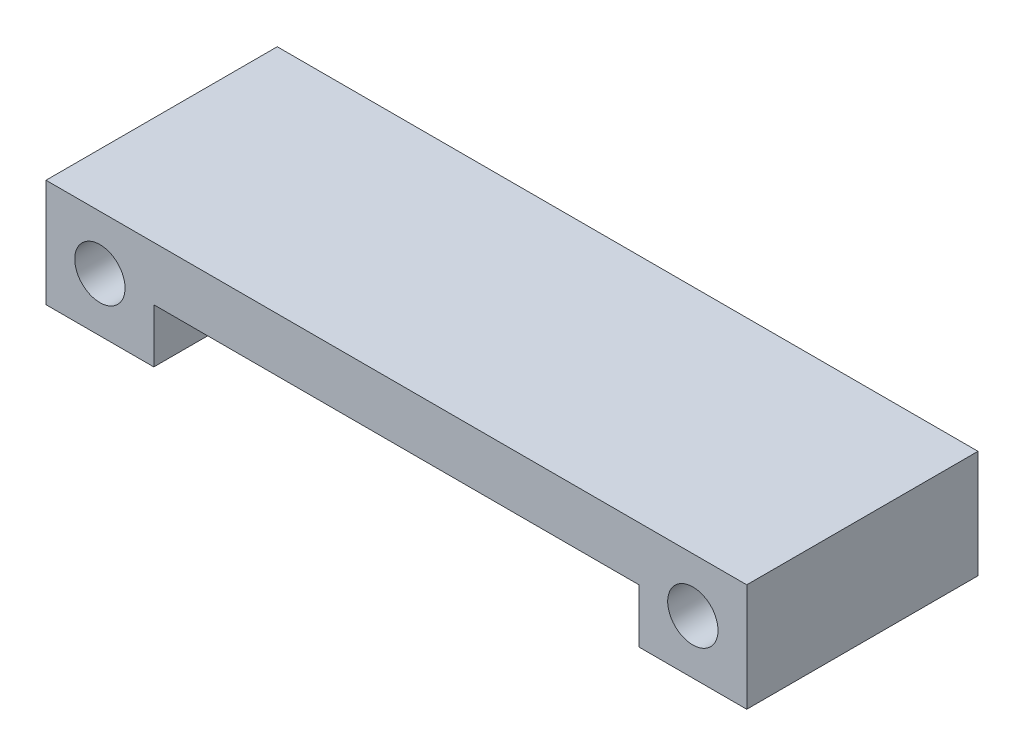
ISO-10303-21;
HEADER;
FILE_DESCRIPTION(('STEP AP214'),'2;1');
FILE_NAME('part.step','',(''),(''),'','','');
FILE_SCHEMA(('AUTOMOTIVE_DESIGN { 1 0 10303 214 1 1 1 1 }'));
ENDSEC;
DATA;
#1=APPLICATION_CONTEXT('core data for automotive mechanical design processes');
#2=APPLICATION_PROTOCOL_DEFINITION('international standard','automotive_design',2000,#1);
#3=PRODUCT_CONTEXT('',#1,'mechanical');
#4=PRODUCT('Part','Part','',(#3));
#5=PRODUCT_RELATED_PRODUCT_CATEGORY('part','',(#4));
#6=PRODUCT_DEFINITION_FORMATION('','',#4);
#7=PRODUCT_DEFINITION_CONTEXT('part definition',#1,'design');
#8=PRODUCT_DEFINITION('design','',#6,#7);
#9=PRODUCT_DEFINITION_SHAPE('','',#8);
#10=(LENGTH_UNIT() NAMED_UNIT(*) SI_UNIT(.MILLI.,.METRE.));
#11=(NAMED_UNIT(*) PLANE_ANGLE_UNIT() SI_UNIT($,.RADIAN.));
#12=(NAMED_UNIT(*) SI_UNIT($,.STERADIAN.) SOLID_ANGLE_UNIT());
#13=UNCERTAINTY_MEASURE_WITH_UNIT(LENGTH_MEASURE(1.E-05),#10,'distance_accuracy_value','');
#14=(GEOMETRIC_REPRESENTATION_CONTEXT(3) GLOBAL_UNCERTAINTY_ASSIGNED_CONTEXT((#13)) GLOBAL_UNIT_ASSIGNED_CONTEXT((#10,
#11,#12)) REPRESENTATION_CONTEXT('',''));
#15=CARTESIAN_POINT('',(0.,0.,0.));
#16=DIRECTION('',(0.,0.,1.));
#17=DIRECTION('',(1.,0.,0.));
#18=AXIS2_PLACEMENT_3D('',#15,#16,#17);
#19=CARTESIAN_POINT('',(-13.5,0.,12.87));
#20=DIRECTION('',(1.,0.,0.));
#21=DIRECTION('',(0.,1.,0.));
#22=AXIS2_PLACEMENT_3D('',#19,#20,#21);
#23=PLANE('',#22);
#24=DIRECTION('',(0.,-1.,0.));
#25=VECTOR('',#24,1.);
#26=CARTESIAN_POINT('',(-13.5,0.,0.));
#27=LINE('',#26,#25);
#28=CARTESIAN_POINT('',(-13.5,0.,0.));
#29=VERTEX_POINT('',#28);
#30=CARTESIAN_POINT('',(-13.5,-3.,0.));
#31=VERTEX_POINT('',#30);
#32=EDGE_CURVE('E140',#29,#31,#27,.T.);
#33=ORIENTED_EDGE('',*,*,#32,.F.);
#34=DIRECTION('',(0.,0.,-1.));
#35=VECTOR('',#34,1.);
#36=CARTESIAN_POINT('',(-13.5,0.,12.87));
#37=LINE('',#36,#35);
#38=CARTESIAN_POINT('',(-13.5,0.,12.87));
#39=VERTEX_POINT('',#38);
#40=EDGE_CURVE('E11',#39,#29,#37,.T.);
#41=ORIENTED_EDGE('',*,*,#40,.F.);
#42=DIRECTION('',(0.,-1.,0.));
#43=VECTOR('',#42,1.);
#44=CARTESIAN_POINT('',(-13.5,0.,12.87));
#45=LINE('',#44,#43);
#46=CARTESIAN_POINT('',(-13.5,-3.,12.87));
#47=VERTEX_POINT('',#46);
#48=EDGE_CURVE('E162',#39,#47,#45,.T.);
#49=ORIENTED_EDGE('',*,*,#48,.T.);
#50=DIRECTION('',(0.,0.,-1.));
#51=VECTOR('',#50,1.);
#52=CARTESIAN_POINT('',(-13.5,-3.,12.87));
#53=LINE('',#52,#51);
#54=EDGE_CURVE('E55',#47,#31,#53,.T.);
#55=ORIENTED_EDGE('',*,*,#54,.T.);
#56=EDGE_LOOP('',(#33,#41,#49,#55));
#57=FACE_BOUND('',#56,.T.);
#58=ADVANCED_FACE('F39',(#57),#23,.T.);
#59=CARTESIAN_POINT('',(0.,0.,12.87));
#60=DIRECTION('',(0.,1.,0.));
#61=DIRECTION('',(-1.,0.,0.));
#62=AXIS2_PLACEMENT_3D('',#59,#60,#61);
#63=PLANE('',#62);
#64=DIRECTION('',(1.,0.,0.));
#65=VECTOR('',#64,1.);
#66=CARTESIAN_POINT('',(0.,0.,0.));
#67=LINE('',#66,#65);
#68=CARTESIAN_POINT('',(13.5,0.,0.));
#69=VERTEX_POINT('',#68);
#70=EDGE_CURVE('E142',#29,#69,#67,.T.);
#71=ORIENTED_EDGE('',*,*,#70,.T.);
#72=DIRECTION('',(0.,0.,-1.));
#73=VECTOR('',#72,1.);
#74=CARTESIAN_POINT('',(13.5,0.,12.87));
#75=LINE('',#74,#73);
#76=CARTESIAN_POINT('',(13.5,0.,12.87));
#77=VERTEX_POINT('',#76);
#78=EDGE_CURVE('E47',#77,#69,#75,.T.);
#79=ORIENTED_EDGE('',*,*,#78,.F.);
#80=DIRECTION('',(1.,0.,0.));
#81=VECTOR('',#80,1.);
#82=CARTESIAN_POINT('',(0.,0.,12.87));
#83=LINE('',#82,#81);
#84=EDGE_CURVE('E196',#39,#77,#83,.T.);
#85=ORIENTED_EDGE('',*,*,#84,.F.);
#86=ORIENTED_EDGE('',*,*,#40,.T.);
#87=EDGE_LOOP('',(#71,#79,#85,#86));
#88=FACE_BOUND('',#87,.T.);
#89=ADVANCED_FACE('F213',(#88),#63,.F.);
#90=CARTESIAN_POINT('',(13.5,0.,12.87));
#91=DIRECTION('',(1.,0.,0.));
#92=DIRECTION('',(0.,1.,0.));
#93=AXIS2_PLACEMENT_3D('',#90,#91,#92);
#94=PLANE('',#93);
#95=DIRECTION('',(0.,-1.,0.));
#96=VECTOR('',#95,1.);
#97=CARTESIAN_POINT('',(13.5,0.,0.));
#98=LINE('',#97,#96);
#99=CARTESIAN_POINT('',(13.5,-2.99999999999999,0.));
#100=VERTEX_POINT('',#99);
#101=EDGE_CURVE('E144',#69,#100,#98,.T.);
#102=ORIENTED_EDGE('',*,*,#101,.T.);
#103=DIRECTION('',(0.,0.,-1.));
#104=VECTOR('',#103,1.);
#105=CARTESIAN_POINT('',(13.5,-2.99999999999999,12.87));
#106=LINE('',#105,#104);
#107=CARTESIAN_POINT('',(13.5,-2.99999999999999,12.87));
#108=VERTEX_POINT('',#107);
#109=EDGE_CURVE('E169',#108,#100,#106,.T.);
#110=ORIENTED_EDGE('',*,*,#109,.F.);
#111=DIRECTION('',(0.,-1.,0.));
#112=VECTOR('',#111,1.);
#113=CARTESIAN_POINT('',(13.5,0.,12.87));
#114=LINE('',#113,#112);
#115=EDGE_CURVE('E178',#77,#108,#114,.T.);
#116=ORIENTED_EDGE('',*,*,#115,.F.);
#117=ORIENTED_EDGE('',*,*,#78,.T.);
#118=EDGE_LOOP('',(#102,#110,#116,#117));
#119=FACE_BOUND('',#118,.T.);
#120=ADVANCED_FACE('F176',(#119),#94,.F.);
#121=CARTESIAN_POINT('',(0.,-2.99999999999999,12.87));
#122=DIRECTION('',(0.,1.,0.));
#123=DIRECTION('',(0.,0.,1.));
#124=AXIS2_PLACEMENT_3D('',#121,#122,#123);
#125=PLANE('',#124);
#126=DIRECTION('',(1.,0.,0.));
#127=VECTOR('',#126,1.);
#128=CARTESIAN_POINT('',(0.,-2.99999999999999,0.));
#129=LINE('',#128,#127);
#130=CARTESIAN_POINT('',(19.5,-2.99999999999999,0.));
#131=VERTEX_POINT('',#130);
#132=EDGE_CURVE('E146',#100,#131,#129,.T.);
#133=ORIENTED_EDGE('',*,*,#132,.T.);
#134=DIRECTION('',(0.,0.,-1.));
#135=VECTOR('',#134,1.);
#136=CARTESIAN_POINT('',(19.5,-2.99999999999999,12.87));
#137=LINE('',#136,#135);
#138=CARTESIAN_POINT('',(19.5,-2.99999999999999,12.87));
#139=VERTEX_POINT('',#138);
#140=EDGE_CURVE('E166',#139,#131,#137,.T.);
#141=ORIENTED_EDGE('',*,*,#140,.F.);
#142=DIRECTION('',(1.,0.,0.));
#143=VECTOR('',#142,1.);
#144=CARTESIAN_POINT('',(0.,-2.99999999999999,12.87));
#145=LINE('',#144,#143);
#146=EDGE_CURVE('E192',#108,#139,#145,.T.);
#147=ORIENTED_EDGE('',*,*,#146,.F.);
#148=ORIENTED_EDGE('',*,*,#109,.T.);
#149=EDGE_LOOP('',(#133,#141,#147,#148));
#150=FACE_BOUND('',#149,.T.);
#151=ADVANCED_FACE('F188',(#150),#125,.F.);
#152=CARTESIAN_POINT('',(19.5,0.,12.87));
#153=DIRECTION('',(-1.,0.,0.));
#154=DIRECTION('',(0.,0.,1.));
#155=AXIS2_PLACEMENT_3D('',#152,#153,#154);
#156=PLANE('',#155);
#157=DIRECTION('',(0.,1.,0.));
#158=VECTOR('',#157,1.);
#159=CARTESIAN_POINT('',(19.5,0.,0.));
#160=LINE('',#159,#158);
#161=CARTESIAN_POINT('',(19.5,3.,0.));
#162=VERTEX_POINT('',#161);
#163=EDGE_CURVE('E148',#131,#162,#160,.T.);
#164=ORIENTED_EDGE('',*,*,#163,.T.);
#165=DIRECTION('',(0.,0.,-1.));
#166=VECTOR('',#165,1.);
#167=CARTESIAN_POINT('',(19.5,3.,12.87));
#168=LINE('',#167,#166);
#169=CARTESIAN_POINT('',(19.5,3.,12.87));
#170=VERTEX_POINT('',#169);
#171=EDGE_CURVE('E126',#170,#162,#168,.T.);
#172=ORIENTED_EDGE('',*,*,#171,.F.);
#173=DIRECTION('',(0.,1.,0.));
#174=VECTOR('',#173,1.);
#175=CARTESIAN_POINT('',(19.5,0.,12.87));
#176=LINE('',#175,#174);
#177=EDGE_CURVE('E114',#139,#170,#176,.T.);
#178=ORIENTED_EDGE('',*,*,#177,.F.);
#179=ORIENTED_EDGE('',*,*,#140,.T.);
#180=EDGE_LOOP('',(#164,#172,#178,#179));
#181=FACE_BOUND('',#180,.T.);
#182=ADVANCED_FACE('F191',(#181),#156,.F.);
#183=CARTESIAN_POINT('',(0.,3.,12.87));
#184=DIRECTION('',(0.,-1.,0.));
#185=DIRECTION('',(1.,0.,0.));
#186=AXIS2_PLACEMENT_3D('',#183,#184,#185);
#187=PLANE('',#186);
#188=DIRECTION('',(-1.,0.,0.));
#189=VECTOR('',#188,1.);
#190=CARTESIAN_POINT('',(0.,3.,0.));
#191=LINE('',#190,#189);
#192=CARTESIAN_POINT('',(-19.5,3.,0.));
#193=VERTEX_POINT('',#192);
#194=EDGE_CURVE('E123',#162,#193,#191,.T.);
#195=ORIENTED_EDGE('',*,*,#194,.T.);
#196=DIRECTION('',(0.,0.,-1.));
#197=VECTOR('',#196,1.);
#198=CARTESIAN_POINT('',(-19.5,3.,12.87));
#199=LINE('',#198,#197);
#200=CARTESIAN_POINT('',(-19.5,3.,12.87));
#201=VERTEX_POINT('',#200);
#202=EDGE_CURVE('E120',#201,#193,#199,.T.);
#203=ORIENTED_EDGE('',*,*,#202,.F.);
#204=DIRECTION('',(-1.,0.,0.));
#205=VECTOR('',#204,1.);
#206=CARTESIAN_POINT('',(0.,3.,12.87));
#207=LINE('',#206,#205);
#208=EDGE_CURVE('E105',#170,#201,#207,.T.);
#209=ORIENTED_EDGE('',*,*,#208,.F.);
#210=ORIENTED_EDGE('',*,*,#171,.T.);
#211=EDGE_LOOP('',(#195,#203,#209,#210));
#212=FACE_BOUND('',#211,.T.);
#213=ADVANCED_FACE('F121',(#212),#187,.F.);
#214=CARTESIAN_POINT('',(-19.5,0.,12.87));
#215=DIRECTION('',(-1.,0.,0.));
#216=DIRECTION('',(0.,0.,1.));
#217=AXIS2_PLACEMENT_3D('',#214,#215,#216);
#218=PLANE('',#217);
#219=DIRECTION('',(0.,1.,0.));
#220=VECTOR('',#219,1.);
#221=CARTESIAN_POINT('',(-19.5,0.,0.));
#222=LINE('',#221,#220);
#223=CARTESIAN_POINT('',(-19.5,-3.,0.));
#224=VERTEX_POINT('',#223);
#225=EDGE_CURVE('E151',#224,#193,#222,.T.);
#226=ORIENTED_EDGE('',*,*,#225,.F.);
#227=DIRECTION('',(0.,0.,-1.));
#228=VECTOR('',#227,1.);
#229=CARTESIAN_POINT('',(-19.5,-3.,12.87));
#230=LINE('',#229,#228);
#231=CARTESIAN_POINT('',(-19.5,-3.,12.87));
#232=VERTEX_POINT('',#231);
#233=EDGE_CURVE('E80',#232,#224,#230,.T.);
#234=ORIENTED_EDGE('',*,*,#233,.F.);
#235=DIRECTION('',(0.,1.,0.));
#236=VECTOR('',#235,1.);
#237=CARTESIAN_POINT('',(-19.5,0.,12.87));
#238=LINE('',#237,#236);
#239=EDGE_CURVE('E112',#232,#201,#238,.T.);
#240=ORIENTED_EDGE('',*,*,#239,.T.);
#241=ORIENTED_EDGE('',*,*,#202,.T.);
#242=EDGE_LOOP('',(#226,#234,#240,#241));
#243=FACE_BOUND('',#242,.T.);
#244=ADVANCED_FACE('F128',(#243),#218,.T.);
#245=CARTESIAN_POINT('',(16.5,0.,12.87));
#246=DIRECTION('',(0.,0.,-1.));
#247=DIRECTION('',(-1.,0.,0.));
#248=AXIS2_PLACEMENT_3D('',#245,#246,#247);
#249=CYLINDRICAL_SURFACE('',#248,1.4);
#250=CARTESIAN_POINT('',(16.5,0.,12.87));
#251=DIRECTION('',(0.,0.,1.));
#252=DIRECTION('',(1.,0.,0.));
#253=AXIS2_PLACEMENT_3D('',#250,#251,#252);
#254=CIRCLE('',#253,1.4);
#255=CARTESIAN_POINT('',(17.9,0.,12.87));
#256=VERTEX_POINT('',#255);
#257=EDGE_CURVE('E131',#256,#256,#254,.T.);
#258=ORIENTED_EDGE('',*,*,#257,.T.);
#259=EDGE_LOOP('',(#258));
#260=FACE_BOUND('',#259,.T.);
#261=CARTESIAN_POINT('',(16.5,0.,0.));
#262=DIRECTION('',(0.,0.,1.));
#263=DIRECTION('',(1.,0.,0.));
#264=AXIS2_PLACEMENT_3D('',#261,#262,#263);
#265=CIRCLE('',#264,1.4);
#266=CARTESIAN_POINT('',(17.9,0.,0.));
#267=VERTEX_POINT('',#266);
#268=EDGE_CURVE('E156',#267,#267,#265,.T.);
#269=ORIENTED_EDGE('',*,*,#268,.F.);
#270=EDGE_LOOP('',(#269));
#271=FACE_BOUND('',#270,.T.);
#272=ADVANCED_FACE('F201',(#260,#271),#249,.F.);
#273=CARTESIAN_POINT('',(0.,-2.99999999999999,12.87));
#274=DIRECTION('',(0.,-1.,0.));
#275=DIRECTION('',(1.,0.,0.));
#276=AXIS2_PLACEMENT_3D('',#273,#274,#275);
#277=PLANE('',#276);
#278=DIRECTION('',(-1.,0.,0.));
#279=VECTOR('',#278,1.);
#280=CARTESIAN_POINT('',(0.,-2.99999999999999,0.));
#281=LINE('',#280,#279);
#282=EDGE_CURVE('E153',#31,#224,#281,.T.);
#283=ORIENTED_EDGE('',*,*,#282,.F.);
#284=ORIENTED_EDGE('',*,*,#54,.F.);
#285=DIRECTION('',(-1.,0.,0.));
#286=VECTOR('',#285,1.);
#287=CARTESIAN_POINT('',(0.,-2.99999999999999,12.87));
#288=LINE('',#287,#286);
#289=EDGE_CURVE('E129',#47,#232,#288,.T.);
#290=ORIENTED_EDGE('',*,*,#289,.T.);
#291=ORIENTED_EDGE('',*,*,#233,.T.);
#292=EDGE_LOOP('',(#283,#284,#290,#291));
#293=FACE_BOUND('',#292,.T.);
#294=ADVANCED_FACE('F198',(#293),#277,.T.);
#295=CARTESIAN_POINT('',(-16.5,0.,12.87));
#296=DIRECTION('',(0.,0.,-1.));
#297=DIRECTION('',(-1.,0.,0.));
#298=AXIS2_PLACEMENT_3D('',#295,#296,#297);
#299=CYLINDRICAL_SURFACE('',#298,1.4);
#300=CARTESIAN_POINT('',(-16.5,0.,12.87));
#301=DIRECTION('',(0.,0.,1.));
#302=DIRECTION('',(1.,0.,0.));
#303=AXIS2_PLACEMENT_3D('',#300,#301,#302);
#304=CIRCLE('',#303,1.4);
#305=CARTESIAN_POINT('',(-15.1,0.,12.87));
#306=VERTEX_POINT('',#305);
#307=EDGE_CURVE('E137',#306,#306,#304,.F.);
#308=ORIENTED_EDGE('',*,*,#307,.F.);
#309=EDGE_LOOP('',(#308));
#310=FACE_BOUND('',#309,.T.);
#311=CARTESIAN_POINT('',(-16.5,0.,0.));
#312=DIRECTION('',(0.,0.,1.));
#313=DIRECTION('',(1.,0.,0.));
#314=AXIS2_PLACEMENT_3D('',#311,#312,#313);
#315=CIRCLE('',#314,1.4);
#316=CARTESIAN_POINT('',(-15.1,0.,0.));
#317=VERTEX_POINT('',#316);
#318=EDGE_CURVE('E159',#317,#317,#315,.F.);
#319=ORIENTED_EDGE('',*,*,#318,.T.);
#320=EDGE_LOOP('',(#319));
#321=FACE_BOUND('',#320,.T.);
#322=ADVANCED_FACE('F200',(#310,#321),#299,.F.);
#323=CARTESIAN_POINT('',(0.,0.,12.87));
#324=DIRECTION('',(0.,0.,1.));
#325=DIRECTION('',(1.,0.,0.));
#326=AXIS2_PLACEMENT_3D('',#323,#324,#325);
#327=PLANE('',#326);
#328=ORIENTED_EDGE('',*,*,#48,.F.);
#329=ORIENTED_EDGE('',*,*,#84,.T.);
#330=ORIENTED_EDGE('',*,*,#115,.T.);
#331=ORIENTED_EDGE('',*,*,#146,.T.);
#332=ORIENTED_EDGE('',*,*,#177,.T.);
#333=ORIENTED_EDGE('',*,*,#208,.T.);
#334=ORIENTED_EDGE('',*,*,#239,.F.);
#335=ORIENTED_EDGE('',*,*,#289,.F.);
#336=EDGE_LOOP('',(#328,#329,#330,#331,#332,#333,#334,#335));
#337=FACE_BOUND('',#336,.T.);
#338=ORIENTED_EDGE('',*,*,#257,.F.);
#339=EDGE_LOOP('',(#338));
#340=FACE_BOUND('',#339,.T.);
#341=ORIENTED_EDGE('',*,*,#307,.T.);
#342=EDGE_LOOP('',(#341));
#343=FACE_BOUND('',#342,.T.);
#344=ADVANCED_FACE('F108',(#337,#340,#343),#327,.T.);
#345=CARTESIAN_POINT('',(0.,0.,0.));
#346=DIRECTION('',(0.,0.,1.));
#347=DIRECTION('',(1.,0.,0.));
#348=AXIS2_PLACEMENT_3D('',#345,#346,#347);
#349=PLANE('',#348);
#350=ORIENTED_EDGE('',*,*,#32,.T.);
#351=ORIENTED_EDGE('',*,*,#282,.T.);
#352=ORIENTED_EDGE('',*,*,#225,.T.);
#353=ORIENTED_EDGE('',*,*,#194,.F.);
#354=ORIENTED_EDGE('',*,*,#163,.F.);
#355=ORIENTED_EDGE('',*,*,#132,.F.);
#356=ORIENTED_EDGE('',*,*,#101,.F.);
#357=ORIENTED_EDGE('',*,*,#70,.F.);
#358=EDGE_LOOP('',(#350,#351,#352,#353,#354,#355,#356,#357));
#359=FACE_BOUND('',#358,.T.);
#360=ORIENTED_EDGE('',*,*,#268,.T.);
#361=EDGE_LOOP('',(#360));
#362=FACE_BOUND('',#361,.T.);
#363=ORIENTED_EDGE('',*,*,#318,.F.);
#364=EDGE_LOOP('',(#363));
#365=FACE_BOUND('',#364,.T.);
#366=ADVANCED_FACE('F183',(#359,#362,#365),#349,.F.);
#367=CLOSED_SHELL('',(#58,#89,#120,#151,#182,#213,#244,#272,#294,#322,#344,#366));
#368=MANIFOLD_SOLID_BREP('B2',#367);
#369=ADVANCED_BREP_SHAPE_REPRESENTATION('',(#18,#368),#14);
#370=SHAPE_DEFINITION_REPRESENTATION(#9,#369);
ENDSEC;
END-ISO-10303-21;
